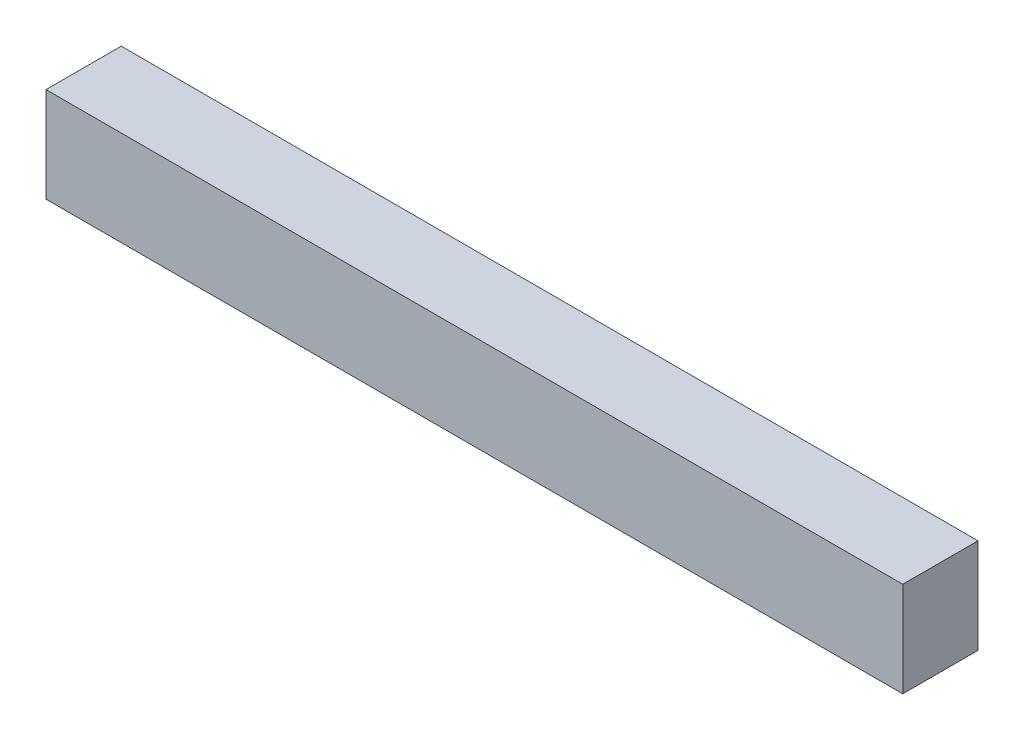
ISO-10303-21;
HEADER;
FILE_DESCRIPTION(('STEP AP214'),'2;1');
FILE_NAME('part.step','',(''),(''),'','','');
FILE_SCHEMA(('AUTOMOTIVE_DESIGN { 1 0 10303 214 1 1 1 1 }'));
ENDSEC;
DATA;
#1=APPLICATION_CONTEXT('core data for automotive mechanical design processes');
#2=APPLICATION_PROTOCOL_DEFINITION('international standard','automotive_design',2000,#1);
#3=PRODUCT_CONTEXT('',#1,'mechanical');
#4=PRODUCT('Part','Part','',(#3));
#5=PRODUCT_RELATED_PRODUCT_CATEGORY('part','',(#4));
#6=PRODUCT_DEFINITION_FORMATION('','',#4);
#7=PRODUCT_DEFINITION_CONTEXT('part definition',#1,'design');
#8=PRODUCT_DEFINITION('design','',#6,#7);
#9=PRODUCT_DEFINITION_SHAPE('','',#8);
#10=(LENGTH_UNIT() NAMED_UNIT(*) SI_UNIT(.MILLI.,.METRE.));
#11=(NAMED_UNIT(*) PLANE_ANGLE_UNIT() SI_UNIT($,.RADIAN.));
#12=(NAMED_UNIT(*) SI_UNIT($,.STERADIAN.) SOLID_ANGLE_UNIT());
#13=UNCERTAINTY_MEASURE_WITH_UNIT(LENGTH_MEASURE(1.E-05),#10,'distance_accuracy_value','');
#14=(GEOMETRIC_REPRESENTATION_CONTEXT(3) GLOBAL_UNCERTAINTY_ASSIGNED_CONTEXT((#13)) GLOBAL_UNIT_ASSIGNED_CONTEXT((#10,
#11,#12)) REPRESENTATION_CONTEXT('',''));
#15=CARTESIAN_POINT('',(0.,0.,0.));
#16=DIRECTION('',(0.,0.,1.));
#17=DIRECTION('',(1.,0.,0.));
#18=AXIS2_PLACEMENT_3D('',#15,#16,#17);
#19=CARTESIAN_POINT('',(82.55,9.145,14.5));
#20=DIRECTION('',(-1.,0.,0.));
#21=DIRECTION('',(0.,0.,1.));
#22=AXIS2_PLACEMENT_3D('',#19,#20,#21);
#23=PLANE('',#22);
#24=DIRECTION('',(0.,1.,0.));
#25=VECTOR('',#24,1.);
#26=CARTESIAN_POINT('',(82.55,9.145,0.));
#27=LINE('',#26,#25);
#28=CARTESIAN_POINT('',(82.55,-9.145,0.));
#29=VERTEX_POINT('',#28);
#30=CARTESIAN_POINT('',(82.55,9.145,0.));
#31=VERTEX_POINT('',#30);
#32=EDGE_CURVE('E106',#29,#31,#27,.T.);
#33=ORIENTED_EDGE('',*,*,#32,.T.);
#34=DIRECTION('',(0.,0.,-1.));
#35=VECTOR('',#34,1.);
#36=CARTESIAN_POINT('',(82.55,9.145,14.5));
#37=LINE('',#36,#35);
#38=CARTESIAN_POINT('',(82.55,9.145,14.5));
#39=VERTEX_POINT('',#38);
#40=EDGE_CURVE('E11',#39,#31,#37,.T.);
#41=ORIENTED_EDGE('',*,*,#40,.F.);
#42=DIRECTION('',(0.,1.,0.));
#43=VECTOR('',#42,1.);
#44=CARTESIAN_POINT('',(82.55,9.145,14.5));
#45=LINE('',#44,#43);
#46=CARTESIAN_POINT('',(82.55,-9.145,14.5));
#47=VERTEX_POINT('',#46);
#48=EDGE_CURVE('E94',#47,#39,#45,.T.);
#49=ORIENTED_EDGE('',*,*,#48,.F.);
#50=DIRECTION('',(0.,0.,-1.));
#51=VECTOR('',#50,1.);
#52=CARTESIAN_POINT('',(82.55,-9.145,14.5));
#53=LINE('',#52,#51);
#54=EDGE_CURVE('E102',#47,#29,#53,.T.);
#55=ORIENTED_EDGE('',*,*,#54,.T.);
#56=EDGE_LOOP('',(#33,#41,#49,#55));
#57=FACE_BOUND('',#56,.T.);
#58=ADVANCED_FACE('F43',(#57),#23,.F.);
#59=CARTESIAN_POINT('',(-82.55,9.145,14.5));
#60=DIRECTION('',(0.,-1.,0.));
#61=DIRECTION('',(0.,0.,-1.));
#62=AXIS2_PLACEMENT_3D('',#59,#60,#61);
#63=PLANE('',#62);
#64=DIRECTION('',(-1.,0.,0.));
#65=VECTOR('',#64,1.);
#66=CARTESIAN_POINT('',(-82.55,9.145,0.));
#67=LINE('',#66,#65);
#68=CARTESIAN_POINT('',(-82.55,9.145,0.));
#69=VERTEX_POINT('',#68);
#70=EDGE_CURVE('E98',#31,#69,#67,.T.);
#71=ORIENTED_EDGE('',*,*,#70,.T.);
#72=DIRECTION('',(0.,0.,-1.));
#73=VECTOR('',#72,1.);
#74=CARTESIAN_POINT('',(-82.55,9.145,14.5));
#75=LINE('',#74,#73);
#76=CARTESIAN_POINT('',(-82.55,9.145,14.5));
#77=VERTEX_POINT('',#76);
#78=EDGE_CURVE('E51',#77,#69,#75,.T.);
#79=ORIENTED_EDGE('',*,*,#78,.F.);
#80=DIRECTION('',(-1.,0.,0.));
#81=VECTOR('',#80,1.);
#82=CARTESIAN_POINT('',(-82.55,9.145,14.5));
#83=LINE('',#82,#81);
#84=EDGE_CURVE('E89',#39,#77,#83,.T.);
#85=ORIENTED_EDGE('',*,*,#84,.F.);
#86=ORIENTED_EDGE('',*,*,#40,.T.);
#87=EDGE_LOOP('',(#71,#79,#85,#86));
#88=FACE_BOUND('',#87,.T.);
#89=ADVANCED_FACE('F97',(#88),#63,.F.);
#90=CARTESIAN_POINT('',(-82.55,9.145,14.5));
#91=DIRECTION('',(1.,0.,0.));
#92=DIRECTION('',(0.,0.,-1.));
#93=AXIS2_PLACEMENT_3D('',#90,#91,#92);
#94=PLANE('',#93);
#95=DIRECTION('',(0.,-1.,0.));
#96=VECTOR('',#95,1.);
#97=CARTESIAN_POINT('',(-82.55,9.145,0.));
#98=LINE('',#97,#96);
#99=CARTESIAN_POINT('',(-82.55,-9.145,0.));
#100=VERTEX_POINT('',#99);
#101=EDGE_CURVE('E76',#69,#100,#98,.T.);
#102=ORIENTED_EDGE('',*,*,#101,.T.);
#103=DIRECTION('',(0.,0.,-1.));
#104=VECTOR('',#103,1.);
#105=CARTESIAN_POINT('',(-82.55,-9.145,14.5));
#106=LINE('',#105,#104);
#107=CARTESIAN_POINT('',(-82.55,-9.145,14.5));
#108=VERTEX_POINT('',#107);
#109=EDGE_CURVE('E99',#108,#100,#106,.T.);
#110=ORIENTED_EDGE('',*,*,#109,.F.);
#111=DIRECTION('',(0.,-1.,0.));
#112=VECTOR('',#111,1.);
#113=CARTESIAN_POINT('',(-82.55,9.145,14.5));
#114=LINE('',#113,#112);
#115=EDGE_CURVE('E92',#77,#108,#114,.T.);
#116=ORIENTED_EDGE('',*,*,#115,.F.);
#117=ORIENTED_EDGE('',*,*,#78,.T.);
#118=EDGE_LOOP('',(#102,#110,#116,#117));
#119=FACE_BOUND('',#118,.T.);
#120=ADVANCED_FACE('F100',(#119),#94,.F.);
#121=CARTESIAN_POINT('',(-82.55,-9.145,14.5));
#122=DIRECTION('',(0.,1.,0.));
#123=DIRECTION('',(0.,0.,1.));
#124=AXIS2_PLACEMENT_3D('',#121,#122,#123);
#125=PLANE('',#124);
#126=DIRECTION('',(1.,0.,0.));
#127=VECTOR('',#126,1.);
#128=CARTESIAN_POINT('',(-82.55,-9.145,0.));
#129=LINE('',#128,#127);
#130=EDGE_CURVE('E82',#100,#29,#129,.T.);
#131=ORIENTED_EDGE('',*,*,#130,.T.);
#132=ORIENTED_EDGE('',*,*,#54,.F.);
#133=DIRECTION('',(1.,0.,0.));
#134=VECTOR('',#133,1.);
#135=CARTESIAN_POINT('',(-82.55,-9.145,14.5));
#136=LINE('',#135,#134);
#137=EDGE_CURVE('E59',#108,#47,#136,.T.);
#138=ORIENTED_EDGE('',*,*,#137,.F.);
#139=ORIENTED_EDGE('',*,*,#109,.T.);
#140=EDGE_LOOP('',(#131,#132,#138,#139));
#141=FACE_BOUND('',#140,.T.);
#142=ADVANCED_FACE('F113',(#141),#125,.F.);
#143=CARTESIAN_POINT('',(0.,0.,14.5));
#144=DIRECTION('',(0.,0.,1.));
#145=DIRECTION('',(1.,0.,0.));
#146=AXIS2_PLACEMENT_3D('',#143,#144,#145);
#147=PLANE('',#146);
#148=ORIENTED_EDGE('',*,*,#48,.T.);
#149=ORIENTED_EDGE('',*,*,#84,.T.);
#150=ORIENTED_EDGE('',*,*,#115,.T.);
#151=ORIENTED_EDGE('',*,*,#137,.T.);
#152=EDGE_LOOP('',(#148,#149,#150,#151));
#153=FACE_BOUND('',#152,.T.);
#154=ADVANCED_FACE('F90',(#153),#147,.T.);
#155=CARTESIAN_POINT('',(0.,0.,0.));
#156=DIRECTION('',(0.,0.,1.));
#157=DIRECTION('',(1.,0.,0.));
#158=AXIS2_PLACEMENT_3D('',#155,#156,#157);
#159=PLANE('',#158);
#160=ORIENTED_EDGE('',*,*,#32,.F.);
#161=ORIENTED_EDGE('',*,*,#130,.F.);
#162=ORIENTED_EDGE('',*,*,#101,.F.);
#163=ORIENTED_EDGE('',*,*,#70,.F.);
#164=EDGE_LOOP('',(#160,#161,#162,#163));
#165=FACE_BOUND('',#164,.T.);
#166=ADVANCED_FACE('F116',(#165),#159,.F.);
#167=CLOSED_SHELL('',(#58,#89,#120,#142,#154,#166));
#168=MANIFOLD_SOLID_BREP('B2',#167);
#169=ADVANCED_BREP_SHAPE_REPRESENTATION('',(#18,#168),#14);
#170=SHAPE_DEFINITION_REPRESENTATION(#9,#169);
ENDSEC;
END-ISO-10303-21;
